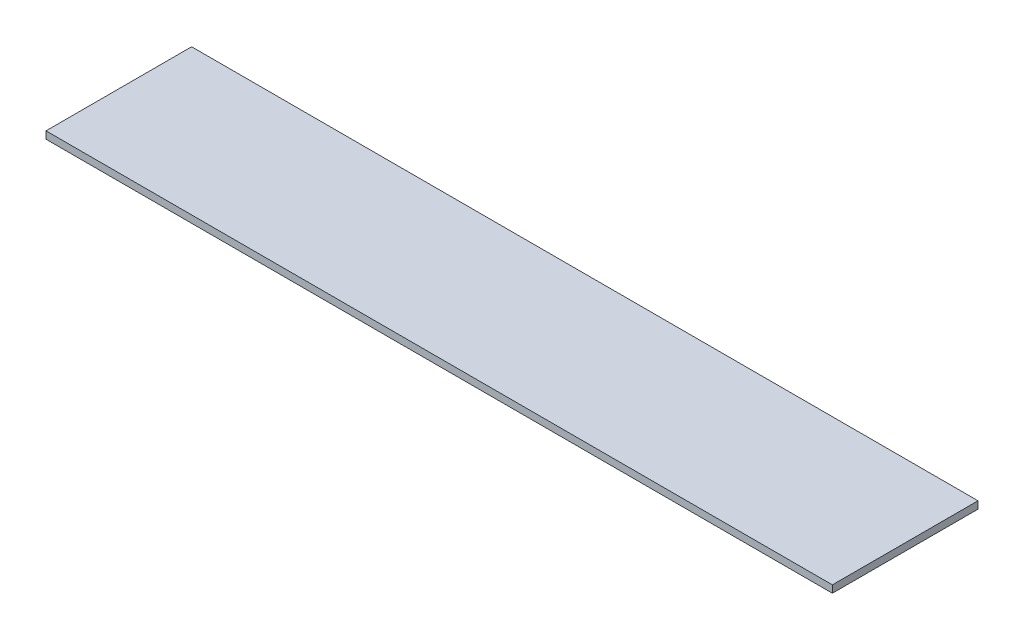
ISO-10303-21;
HEADER;
FILE_DESCRIPTION(('STEP AP214'),'2;1');
FILE_NAME('part.step','',(''),(''),'','','');
FILE_SCHEMA(('AUTOMOTIVE_DESIGN { 1 0 10303 214 1 1 1 1 }'));
ENDSEC;
DATA;
#1=APPLICATION_CONTEXT('core data for automotive mechanical design processes');
#2=APPLICATION_PROTOCOL_DEFINITION('international standard','automotive_design',2000,#1);
#3=PRODUCT_CONTEXT('',#1,'mechanical');
#4=PRODUCT('Part','Part','',(#3));
#5=PRODUCT_RELATED_PRODUCT_CATEGORY('part','',(#4));
#6=PRODUCT_DEFINITION_FORMATION('','',#4);
#7=PRODUCT_DEFINITION_CONTEXT('part definition',#1,'design');
#8=PRODUCT_DEFINITION('design','',#6,#7);
#9=PRODUCT_DEFINITION_SHAPE('','',#8);
#10=(LENGTH_UNIT() NAMED_UNIT(*) SI_UNIT(.MILLI.,.METRE.));
#11=(NAMED_UNIT(*) PLANE_ANGLE_UNIT() SI_UNIT($,.RADIAN.));
#12=(NAMED_UNIT(*) SI_UNIT($,.STERADIAN.) SOLID_ANGLE_UNIT());
#13=UNCERTAINTY_MEASURE_WITH_UNIT(LENGTH_MEASURE(1.E-05),#10,'distance_accuracy_value','');
#14=(GEOMETRIC_REPRESENTATION_CONTEXT(3) GLOBAL_UNCERTAINTY_ASSIGNED_CONTEXT((#13)) GLOBAL_UNIT_ASSIGNED_CONTEXT((#10,
#11,#12)) REPRESENTATION_CONTEXT('',''));
#15=CARTESIAN_POINT('',(0.,0.,0.));
#16=DIRECTION('',(0.,0.,1.));
#17=DIRECTION('',(1.,0.,0.));
#18=AXIS2_PLACEMENT_3D('',#15,#16,#17);
#19=CARTESIAN_POINT('',(0.,25.4,-254.));
#20=DIRECTION('',(1.,0.,0.));
#21=DIRECTION('',(0.,0.,-1.));
#22=AXIS2_PLACEMENT_3D('',#19,#20,#21);
#23=PLANE('',#22);
#24=DIRECTION('',(0.,0.,1.));
#25=VECTOR('',#24,1.);
#26=CARTESIAN_POINT('',(0.,0.,-254.));
#27=LINE('',#26,#25);
#28=CARTESIAN_POINT('',(0.,0.,-254.));
#29=VERTEX_POINT('',#28);
#30=CARTESIAN_POINT('',(0.,0.,254.));
#31=VERTEX_POINT('',#30);
#32=EDGE_CURVE('E75',#29,#31,#27,.T.);
#33=ORIENTED_EDGE('',*,*,#32,.T.);
#34=DIRECTION('',(0.,-1.,0.));
#35=VECTOR('',#34,1.);
#36=CARTESIAN_POINT('',(0.,25.4,254.));
#37=LINE('',#36,#35);
#38=CARTESIAN_POINT('',(0.,25.4,254.));
#39=VERTEX_POINT('',#38);
#40=EDGE_CURVE('E11',#39,#31,#37,.T.);
#41=ORIENTED_EDGE('',*,*,#40,.F.);
#42=DIRECTION('',(0.,0.,1.));
#43=VECTOR('',#42,1.);
#44=CARTESIAN_POINT('',(0.,25.4,-254.));
#45=LINE('',#44,#43);
#46=CARTESIAN_POINT('',(0.,25.4,-254.));
#47=VERTEX_POINT('',#46);
#48=EDGE_CURVE('E93',#47,#39,#45,.T.);
#49=ORIENTED_EDGE('',*,*,#48,.F.);
#50=DIRECTION('',(0.,-1.,0.));
#51=VECTOR('',#50,1.);
#52=CARTESIAN_POINT('',(0.,25.4,-254.));
#53=LINE('',#52,#51);
#54=EDGE_CURVE('E87',#47,#29,#53,.T.);
#55=ORIENTED_EDGE('',*,*,#54,.T.);
#56=EDGE_LOOP('',(#33,#41,#49,#55));
#57=FACE_BOUND('',#56,.T.);
#58=ADVANCED_FACE('F31',(#57),#23,.F.);
#59=CARTESIAN_POINT('',(0.,25.4,254.));
#60=DIRECTION('',(0.,0.,-1.));
#61=DIRECTION('',(-1.,0.,0.));
#62=AXIS2_PLACEMENT_3D('',#59,#60,#61);
#63=PLANE('',#62);
#64=DIRECTION('',(1.,0.,0.));
#65=VECTOR('',#64,1.);
#66=CARTESIAN_POINT('',(0.,0.,254.));
#67=LINE('',#66,#65);
#68=CARTESIAN_POINT('',(2743.2,0.,254.));
#69=VERTEX_POINT('',#68);
#70=EDGE_CURVE('E71',#31,#69,#67,.T.);
#71=ORIENTED_EDGE('',*,*,#70,.T.);
#72=DIRECTION('',(0.,-1.,0.));
#73=VECTOR('',#72,1.);
#74=CARTESIAN_POINT('',(2743.2,25.4,254.));
#75=LINE('',#74,#73);
#76=CARTESIAN_POINT('',(2743.2,25.4,254.));
#77=VERTEX_POINT('',#76);
#78=EDGE_CURVE('E38',#77,#69,#75,.T.);
#79=ORIENTED_EDGE('',*,*,#78,.F.);
#80=DIRECTION('',(1.,0.,0.));
#81=VECTOR('',#80,1.);
#82=CARTESIAN_POINT('',(0.,25.4,254.));
#83=LINE('',#82,#81);
#84=EDGE_CURVE('E83',#39,#77,#83,.T.);
#85=ORIENTED_EDGE('',*,*,#84,.F.);
#86=ORIENTED_EDGE('',*,*,#40,.T.);
#87=EDGE_LOOP('',(#71,#79,#85,#86));
#88=FACE_BOUND('',#87,.T.);
#89=ADVANCED_FACE('F82',(#88),#63,.F.);
#90=CARTESIAN_POINT('',(2743.2,25.4,-254.));
#91=DIRECTION('',(-1.,0.,0.));
#92=DIRECTION('',(0.,0.,1.));
#93=AXIS2_PLACEMENT_3D('',#90,#91,#92);
#94=PLANE('',#93);
#95=DIRECTION('',(0.,0.,-1.));
#96=VECTOR('',#95,1.);
#97=CARTESIAN_POINT('',(2743.2,0.,-254.));
#98=LINE('',#97,#96);
#99=CARTESIAN_POINT('',(2743.2,0.,-254.));
#100=VERTEX_POINT('',#99);
#101=EDGE_CURVE('E76',#69,#100,#98,.T.);
#102=ORIENTED_EDGE('',*,*,#101,.T.);
#103=DIRECTION('',(0.,-1.,0.));
#104=VECTOR('',#103,1.);
#105=CARTESIAN_POINT('',(2743.2,25.4,-254.));
#106=LINE('',#105,#104);
#107=CARTESIAN_POINT('',(2743.2,25.4,-254.));
#108=VERTEX_POINT('',#107);
#109=EDGE_CURVE('E99',#108,#100,#106,.T.);
#110=ORIENTED_EDGE('',*,*,#109,.F.);
#111=DIRECTION('',(0.,0.,-1.));
#112=VECTOR('',#111,1.);
#113=CARTESIAN_POINT('',(2743.2,25.4,-254.));
#114=LINE('',#113,#112);
#115=EDGE_CURVE('E50',#77,#108,#114,.T.);
#116=ORIENTED_EDGE('',*,*,#115,.F.);
#117=ORIENTED_EDGE('',*,*,#78,.T.);
#118=EDGE_LOOP('',(#102,#110,#116,#117));
#119=FACE_BOUND('',#118,.T.);
#120=ADVANCED_FACE('F102',(#119),#94,.F.);
#121=CARTESIAN_POINT('',(0.,25.4,-254.));
#122=DIRECTION('',(0.,0.,1.));
#123=DIRECTION('',(1.,0.,0.));
#124=AXIS2_PLACEMENT_3D('',#121,#122,#123);
#125=PLANE('',#124);
#126=DIRECTION('',(-1.,0.,0.));
#127=VECTOR('',#126,1.);
#128=CARTESIAN_POINT('',(0.,0.,-254.));
#129=LINE('',#128,#127);
#130=EDGE_CURVE('E91',#100,#29,#129,.T.);
#131=ORIENTED_EDGE('',*,*,#130,.T.);
#132=ORIENTED_EDGE('',*,*,#54,.F.);
#133=DIRECTION('',(-1.,0.,0.));
#134=VECTOR('',#133,1.);
#135=CARTESIAN_POINT('',(0.,25.4,-254.));
#136=LINE('',#135,#134);
#137=EDGE_CURVE('E45',#108,#47,#136,.T.);
#138=ORIENTED_EDGE('',*,*,#137,.F.);
#139=ORIENTED_EDGE('',*,*,#109,.T.);
#140=EDGE_LOOP('',(#131,#132,#138,#139));
#141=FACE_BOUND('',#140,.T.);
#142=ADVANCED_FACE('F104',(#141),#125,.F.);
#143=CARTESIAN_POINT('',(0.,25.4,254.));
#144=DIRECTION('',(0.,1.,0.));
#145=DIRECTION('',(0.,0.,1.));
#146=AXIS2_PLACEMENT_3D('',#143,#144,#145);
#147=PLANE('',#146);
#148=ORIENTED_EDGE('',*,*,#48,.T.);
#149=ORIENTED_EDGE('',*,*,#84,.T.);
#150=ORIENTED_EDGE('',*,*,#115,.T.);
#151=ORIENTED_EDGE('',*,*,#137,.T.);
#152=EDGE_LOOP('',(#148,#149,#150,#151));
#153=FACE_BOUND('',#152,.T.);
#154=ADVANCED_FACE('F105',(#153),#147,.T.);
#155=CARTESIAN_POINT('',(0.,0.,254.));
#156=DIRECTION('',(0.,1.,0.));
#157=DIRECTION('',(0.,0.,1.));
#158=AXIS2_PLACEMENT_3D('',#155,#156,#157);
#159=PLANE('',#158);
#160=ORIENTED_EDGE('',*,*,#32,.F.);
#161=ORIENTED_EDGE('',*,*,#130,.F.);
#162=ORIENTED_EDGE('',*,*,#101,.F.);
#163=ORIENTED_EDGE('',*,*,#70,.F.);
#164=EDGE_LOOP('',(#160,#161,#162,#163));
#165=FACE_BOUND('',#164,.T.);
#166=ADVANCED_FACE('F72',(#165),#159,.F.);
#167=CLOSED_SHELL('',(#58,#89,#120,#142,#154,#166));
#168=MANIFOLD_SOLID_BREP('B2',#167);
#169=ADVANCED_BREP_SHAPE_REPRESENTATION('',(#18,#168),#14);
#170=SHAPE_DEFINITION_REPRESENTATION(#9,#169);
ENDSEC;
END-ISO-10303-21;
